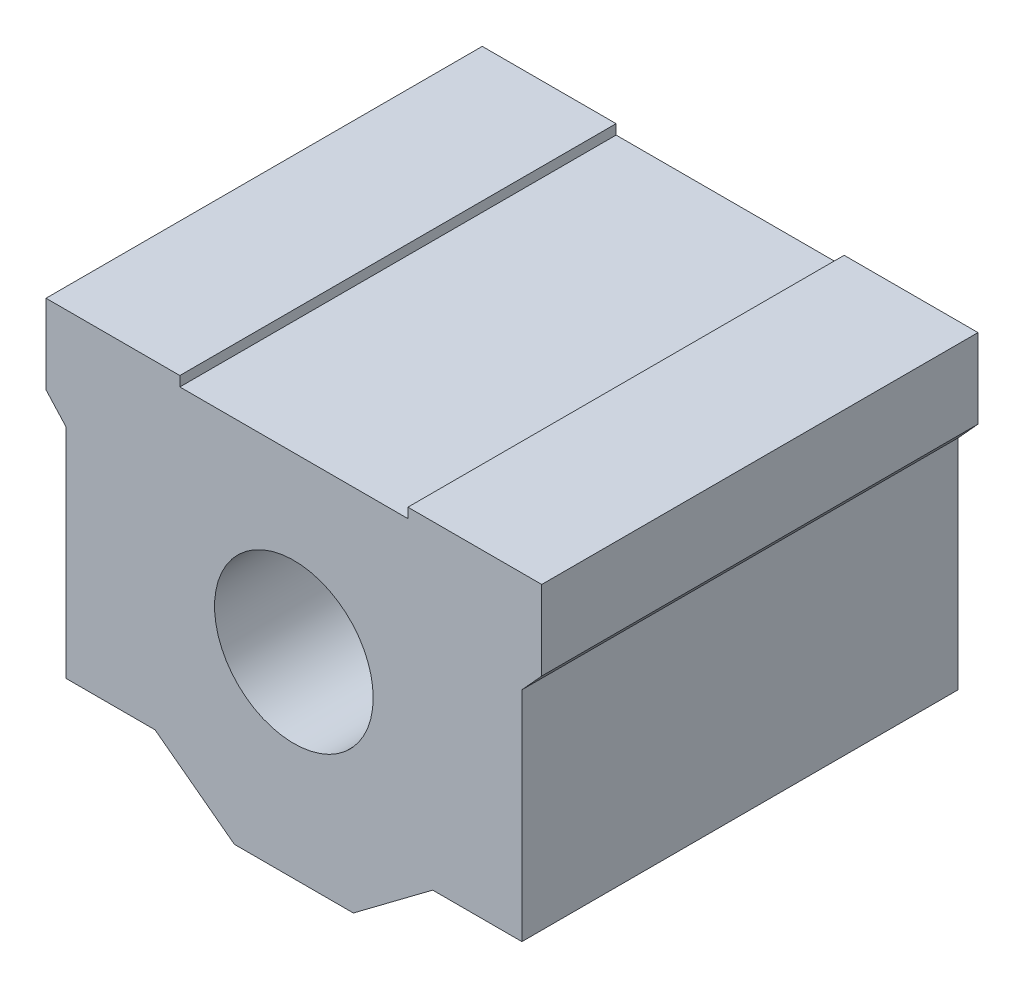
ISO-10303-21;
HEADER;
FILE_DESCRIPTION(('STEP AP214'),'2;1');
FILE_NAME('part.step','',(''),(''),'','','');
FILE_SCHEMA(('AUTOMOTIVE_DESIGN { 1 0 10303 214 1 1 1 1 }'));
ENDSEC;
DATA;
#1=APPLICATION_CONTEXT('core data for automotive mechanical design processes');
#2=APPLICATION_PROTOCOL_DEFINITION('international standard','automotive_design',2000,#1);
#3=PRODUCT_CONTEXT('',#1,'mechanical');
#4=PRODUCT('Part','Part','',(#3));
#5=PRODUCT_RELATED_PRODUCT_CATEGORY('part','',(#4));
#6=PRODUCT_DEFINITION_FORMATION('','',#4);
#7=PRODUCT_DEFINITION_CONTEXT('part definition',#1,'design');
#8=PRODUCT_DEFINITION('design','',#6,#7);
#9=PRODUCT_DEFINITION_SHAPE('','',#8);
#10=(LENGTH_UNIT() NAMED_UNIT(*) SI_UNIT(.MILLI.,.METRE.));
#11=(NAMED_UNIT(*) PLANE_ANGLE_UNIT() SI_UNIT($,.RADIAN.));
#12=(NAMED_UNIT(*) SI_UNIT($,.STERADIAN.) SOLID_ANGLE_UNIT());
#13=UNCERTAINTY_MEASURE_WITH_UNIT(LENGTH_MEASURE(1.E-05),#10,'distance_accuracy_value','');
#14=(GEOMETRIC_REPRESENTATION_CONTEXT(3) GLOBAL_UNCERTAINTY_ASSIGNED_CONTEXT((#13)) GLOBAL_UNIT_ASSIGNED_CONTEXT((#10,
#11,#12)) REPRESENTATION_CONTEXT('',''));
#15=CARTESIAN_POINT('',(0.,0.,0.));
#16=DIRECTION('',(0.,0.,1.));
#17=DIRECTION('',(1.,0.,0.));
#18=AXIS2_PLACEMENT_3D('',#15,#16,#17);
#19=CARTESIAN_POINT('',(0.,0.,44.));
#20=DIRECTION('',(0.,0.,-1.));
#21=DIRECTION('',(-1.,0.,0.));
#22=AXIS2_PLACEMENT_3D('',#19,#20,#21);
#23=PLANE('',#22);
#24=DIRECTION('',(0.8,-0.6,0.));
#25=VECTOR('',#24,1.);
#26=CARTESIAN_POINT('',(-5.99999999999999,0.,44.));
#27=LINE('',#26,#25);
#28=CARTESIAN_POINT('',(-14.,6.,44.));
#29=VERTEX_POINT('',#28);
#30=CARTESIAN_POINT('',(-5.99999999999999,0.,44.));
#31=VERTEX_POINT('',#30);
#32=EDGE_CURVE('E212',#29,#31,#27,.T.);
#33=ORIENTED_EDGE('',*,*,#32,.T.);
#34=DIRECTION('',(1.,0.,0.));
#35=VECTOR('',#34,1.);
#36=CARTESIAN_POINT('',(6.00000000000001,0.,44.));
#37=LINE('',#36,#35);
#38=CARTESIAN_POINT('',(6.00000000000001,0.,44.));
#39=VERTEX_POINT('',#38);
#40=EDGE_CURVE('E120',#31,#39,#37,.T.);
#41=ORIENTED_EDGE('',*,*,#40,.T.);
#42=DIRECTION('',(0.8,0.6,0.));
#43=VECTOR('',#42,1.);
#44=CARTESIAN_POINT('',(6.00000000000001,0.,44.));
#45=LINE('',#44,#43);
#46=CARTESIAN_POINT('',(14.,6.00000000000001,44.));
#47=VERTEX_POINT('',#46);
#48=EDGE_CURVE('E251',#39,#47,#45,.T.);
#49=ORIENTED_EDGE('',*,*,#48,.T.);
#50=DIRECTION('',(1.,0.,0.));
#51=VECTOR('',#50,1.);
#52=CARTESIAN_POINT('',(14.,6.00000000000001,44.));
#53=LINE('',#52,#51);
#54=CARTESIAN_POINT('',(23.,6.00000000000001,44.));
#55=VERTEX_POINT('',#54);
#56=EDGE_CURVE('E270',#47,#55,#53,.T.);
#57=ORIENTED_EDGE('',*,*,#56,.T.);
#58=DIRECTION('',(0.,1.,0.));
#59=VECTOR('',#58,1.);
#60=CARTESIAN_POINT('',(23.,6.00000000000001,44.));
#61=LINE('',#60,#59);
#62=CARTESIAN_POINT('',(23.,28.,44.));
#63=VERTEX_POINT('',#62);
#64=EDGE_CURVE('E267',#55,#63,#61,.T.);
#65=ORIENTED_EDGE('',*,*,#64,.T.);
#66=DIRECTION('',(0.672672793996312,0.739940073395944,0.));
#67=VECTOR('',#66,1.);
#68=CARTESIAN_POINT('',(23.,28.,44.));
#69=LINE('',#68,#67);
#70=CARTESIAN_POINT('',(25.,30.2,44.));
#71=VERTEX_POINT('',#70);
#72=EDGE_CURVE('E269',#63,#71,#69,.T.);
#73=ORIENTED_EDGE('',*,*,#72,.T.);
#74=DIRECTION('',(0.,1.,0.));
#75=VECTOR('',#74,1.);
#76=CARTESIAN_POINT('',(25.,30.2,44.));
#77=LINE('',#76,#75);
#78=CARTESIAN_POINT('',(25.,38.2,44.));
#79=VERTEX_POINT('',#78);
#80=EDGE_CURVE('E272',#71,#79,#77,.T.);
#81=ORIENTED_EDGE('',*,*,#80,.T.);
#82=DIRECTION('',(-1.,0.,0.));
#83=VECTOR('',#82,1.);
#84=CARTESIAN_POINT('',(25.,38.2,44.));
#85=LINE('',#84,#83);
#86=CARTESIAN_POINT('',(11.5,38.2,44.));
#87=VERTEX_POINT('',#86);
#88=EDGE_CURVE('E278',#79,#87,#85,.T.);
#89=ORIENTED_EDGE('',*,*,#88,.T.);
#90=DIRECTION('',(0.,-1.,0.));
#91=VECTOR('',#90,1.);
#92=CARTESIAN_POINT('',(11.5,38.2,44.));
#93=LINE('',#92,#91);
#94=CARTESIAN_POINT('',(11.5,37.2,44.));
#95=VERTEX_POINT('',#94);
#96=EDGE_CURVE('E280',#87,#95,#93,.T.);
#97=ORIENTED_EDGE('',*,*,#96,.T.);
#98=DIRECTION('',(-1.,0.,0.));
#99=VECTOR('',#98,1.);
#100=CARTESIAN_POINT('',(-11.5,37.2,44.));
#101=LINE('',#100,#99);
#102=CARTESIAN_POINT('',(-11.5,37.2,44.));
#103=VERTEX_POINT('',#102);
#104=EDGE_CURVE('E282',#95,#103,#101,.T.);
#105=ORIENTED_EDGE('',*,*,#104,.T.);
#106=DIRECTION('',(0.,1.,0.));
#107=VECTOR('',#106,1.);
#108=CARTESIAN_POINT('',(-11.5,38.2,44.));
#109=LINE('',#108,#107);
#110=CARTESIAN_POINT('',(-11.5,38.2,44.));
#111=VERTEX_POINT('',#110);
#112=EDGE_CURVE('E284',#103,#111,#109,.T.);
#113=ORIENTED_EDGE('',*,*,#112,.T.);
#114=DIRECTION('',(-1.,0.,0.));
#115=VECTOR('',#114,1.);
#116=CARTESIAN_POINT('',(-25.,38.2,44.));
#117=LINE('',#116,#115);
#118=CARTESIAN_POINT('',(-25.,38.2,44.));
#119=VERTEX_POINT('',#118);
#120=EDGE_CURVE('E286',#111,#119,#117,.T.);
#121=ORIENTED_EDGE('',*,*,#120,.T.);
#122=DIRECTION('',(0.,-1.,0.));
#123=VECTOR('',#122,1.);
#124=CARTESIAN_POINT('',(-25.,30.2,44.));
#125=LINE('',#124,#123);
#126=CARTESIAN_POINT('',(-25.,30.2,44.));
#127=VERTEX_POINT('',#126);
#128=EDGE_CURVE('E163',#119,#127,#125,.T.);
#129=ORIENTED_EDGE('',*,*,#128,.T.);
#130=DIRECTION('',(0.672672793996312,-0.739940073395944,0.));
#131=VECTOR('',#130,1.);
#132=CARTESIAN_POINT('',(-23.,28.,44.));
#133=LINE('',#132,#131);
#134=CARTESIAN_POINT('',(-23.,28.,44.));
#135=VERTEX_POINT('',#134);
#136=EDGE_CURVE('E157',#127,#135,#133,.T.);
#137=ORIENTED_EDGE('',*,*,#136,.T.);
#138=DIRECTION('',(0.,-1.,0.));
#139=VECTOR('',#138,1.);
#140=CARTESIAN_POINT('',(-23.,6.,44.));
#141=LINE('',#140,#139);
#142=CARTESIAN_POINT('',(-23.,6.,44.));
#143=VERTEX_POINT('',#142);
#144=EDGE_CURVE('E161',#135,#143,#141,.T.);
#145=ORIENTED_EDGE('',*,*,#144,.T.);
#146=DIRECTION('',(1.,0.,0.));
#147=VECTOR('',#146,1.);
#148=CARTESIAN_POINT('',(-14.,6.,44.));
#149=LINE('',#148,#147);
#150=EDGE_CURVE('E53',#143,#29,#149,.T.);
#151=ORIENTED_EDGE('',*,*,#150,.T.);
#152=EDGE_LOOP('',(#33,#41,#49,#57,#65,#73,#81,#89,#97,#105,#113,#121,#129,#137,#145,#151));
#153=FACE_BOUND('',#152,.T.);
#154=CARTESIAN_POINT('',(0.,19.8,44.));
#155=DIRECTION('',(0.,0.,1.));
#156=DIRECTION('',(1.,0.,0.));
#157=AXIS2_PLACEMENT_3D('',#154,#155,#156);
#158=CIRCLE('',#157,8.);
#159=CARTESIAN_POINT('',(8.,19.8,44.));
#160=VERTEX_POINT('',#159);
#161=EDGE_CURVE('E185',#160,#160,#158,.T.);
#162=ORIENTED_EDGE('',*,*,#161,.F.);
#163=EDGE_LOOP('',(#162));
#164=FACE_BOUND('',#163,.T.);
#165=ADVANCED_FACE('F36',(#153,#164),#23,.F.);
#166=CARTESIAN_POINT('',(0.,0.,0.));
#167=DIRECTION('',(0.,0.,-1.));
#168=DIRECTION('',(-1.,0.,0.));
#169=AXIS2_PLACEMENT_3D('',#166,#167,#168);
#170=PLANE('',#169);
#171=DIRECTION('',(0.8,-0.6,0.));
#172=VECTOR('',#171,1.);
#173=CARTESIAN_POINT('',(-5.99999999999999,0.,0.));
#174=LINE('',#173,#172);
#175=CARTESIAN_POINT('',(-14.,6.,0.));
#176=VERTEX_POINT('',#175);
#177=CARTESIAN_POINT('',(-5.99999999999999,0.,0.));
#178=VERTEX_POINT('',#177);
#179=EDGE_CURVE('E181',#176,#178,#174,.T.);
#180=ORIENTED_EDGE('',*,*,#179,.F.);
#181=DIRECTION('',(1.,0.,0.));
#182=VECTOR('',#181,1.);
#183=CARTESIAN_POINT('',(-14.,6.,0.));
#184=LINE('',#183,#182);
#185=CARTESIAN_POINT('',(-23.,6.,0.));
#186=VERTEX_POINT('',#185);
#187=EDGE_CURVE('E112',#186,#176,#184,.T.);
#188=ORIENTED_EDGE('',*,*,#187,.F.);
#189=DIRECTION('',(0.,-1.,0.));
#190=VECTOR('',#189,1.);
#191=CARTESIAN_POINT('',(-23.,6.,0.));
#192=LINE('',#191,#190);
#193=CARTESIAN_POINT('',(-23.,28.,0.));
#194=VERTEX_POINT('',#193);
#195=EDGE_CURVE('E106',#194,#186,#192,.T.);
#196=ORIENTED_EDGE('',*,*,#195,.F.);
#197=DIRECTION('',(0.672672793996312,-0.739940073395944,0.));
#198=VECTOR('',#197,1.);
#199=CARTESIAN_POINT('',(-23.,28.,0.));
#200=LINE('',#199,#198);
#201=CARTESIAN_POINT('',(-25.,30.2,0.));
#202=VERTEX_POINT('',#201);
#203=EDGE_CURVE('E171',#202,#194,#200,.T.);
#204=ORIENTED_EDGE('',*,*,#203,.F.);
#205=DIRECTION('',(0.,-1.,0.));
#206=VECTOR('',#205,1.);
#207=CARTESIAN_POINT('',(-25.,30.2,0.));
#208=LINE('',#207,#206);
#209=CARTESIAN_POINT('',(-25.,38.2,0.));
#210=VERTEX_POINT('',#209);
#211=EDGE_CURVE('E207',#210,#202,#208,.T.);
#212=ORIENTED_EDGE('',*,*,#211,.F.);
#213=DIRECTION('',(-1.,0.,0.));
#214=VECTOR('',#213,1.);
#215=CARTESIAN_POINT('',(-25.,38.2,0.));
#216=LINE('',#215,#214);
#217=CARTESIAN_POINT('',(-11.5,38.2,0.));
#218=VERTEX_POINT('',#217);
#219=EDGE_CURVE('E205',#218,#210,#216,.T.);
#220=ORIENTED_EDGE('',*,*,#219,.F.);
#221=DIRECTION('',(0.,1.,0.));
#222=VECTOR('',#221,1.);
#223=CARTESIAN_POINT('',(-11.5,38.2,0.));
#224=LINE('',#223,#222);
#225=CARTESIAN_POINT('',(-11.5,37.2,0.));
#226=VERTEX_POINT('',#225);
#227=EDGE_CURVE('E203',#226,#218,#224,.T.);
#228=ORIENTED_EDGE('',*,*,#227,.F.);
#229=DIRECTION('',(-1.,0.,0.));
#230=VECTOR('',#229,1.);
#231=CARTESIAN_POINT('',(-11.5,37.2,0.));
#232=LINE('',#231,#230);
#233=CARTESIAN_POINT('',(11.5,37.2,0.));
#234=VERTEX_POINT('',#233);
#235=EDGE_CURVE('E201',#234,#226,#232,.T.);
#236=ORIENTED_EDGE('',*,*,#235,.F.);
#237=DIRECTION('',(0.,-1.,0.));
#238=VECTOR('',#237,1.);
#239=CARTESIAN_POINT('',(11.5,38.2,0.));
#240=LINE('',#239,#238);
#241=CARTESIAN_POINT('',(11.5,38.2,0.));
#242=VERTEX_POINT('',#241);
#243=EDGE_CURVE('E199',#242,#234,#240,.T.);
#244=ORIENTED_EDGE('',*,*,#243,.F.);
#245=DIRECTION('',(-1.,0.,0.));
#246=VECTOR('',#245,1.);
#247=CARTESIAN_POINT('',(25.,38.2,0.));
#248=LINE('',#247,#246);
#249=CARTESIAN_POINT('',(25.,38.2,0.));
#250=VERTEX_POINT('',#249);
#251=EDGE_CURVE('E197',#250,#242,#248,.T.);
#252=ORIENTED_EDGE('',*,*,#251,.F.);
#253=DIRECTION('',(0.,1.,0.));
#254=VECTOR('',#253,1.);
#255=CARTESIAN_POINT('',(25.,30.2,0.));
#256=LINE('',#255,#254);
#257=CARTESIAN_POINT('',(25.,30.2,0.));
#258=VERTEX_POINT('',#257);
#259=EDGE_CURVE('E195',#258,#250,#256,.T.);
#260=ORIENTED_EDGE('',*,*,#259,.F.);
#261=DIRECTION('',(0.672672793996312,0.739940073395944,0.));
#262=VECTOR('',#261,1.);
#263=CARTESIAN_POINT('',(23.,28.,0.));
#264=LINE('',#263,#262);
#265=CARTESIAN_POINT('',(23.,28.,0.));
#266=VERTEX_POINT('',#265);
#267=EDGE_CURVE('E193',#266,#258,#264,.T.);
#268=ORIENTED_EDGE('',*,*,#267,.F.);
#269=DIRECTION('',(0.,1.,0.));
#270=VECTOR('',#269,1.);
#271=CARTESIAN_POINT('',(23.,6.00000000000001,0.));
#272=LINE('',#271,#270);
#273=CARTESIAN_POINT('',(23.,6.00000000000001,0.));
#274=VERTEX_POINT('',#273);
#275=EDGE_CURVE('E191',#274,#266,#272,.T.);
#276=ORIENTED_EDGE('',*,*,#275,.F.);
#277=DIRECTION('',(1.,0.,0.));
#278=VECTOR('',#277,1.);
#279=CARTESIAN_POINT('',(14.,6.00000000000001,0.));
#280=LINE('',#279,#278);
#281=CARTESIAN_POINT('',(14.,6.00000000000001,0.));
#282=VERTEX_POINT('',#281);
#283=EDGE_CURVE('E189',#282,#274,#280,.T.);
#284=ORIENTED_EDGE('',*,*,#283,.F.);
#285=DIRECTION('',(0.8,0.6,0.));
#286=VECTOR('',#285,1.);
#287=CARTESIAN_POINT('',(6.00000000000001,0.,0.));
#288=LINE('',#287,#286);
#289=CARTESIAN_POINT('',(6.00000000000001,0.,0.));
#290=VERTEX_POINT('',#289);
#291=EDGE_CURVE('E187',#290,#282,#288,.T.);
#292=ORIENTED_EDGE('',*,*,#291,.F.);
#293=DIRECTION('',(1.,0.,0.));
#294=VECTOR('',#293,1.);
#295=CARTESIAN_POINT('',(6.00000000000001,0.,0.));
#296=LINE('',#295,#294);
#297=EDGE_CURVE('E184',#178,#290,#296,.T.);
#298=ORIENTED_EDGE('',*,*,#297,.F.);
#299=EDGE_LOOP('',(#180,#188,#196,#204,#212,#220,#228,#236,#244,#252,#260,#268,#276,#284,#292,#298));
#300=FACE_BOUND('',#299,.T.);
#301=CARTESIAN_POINT('',(0.,19.8,0.));
#302=DIRECTION('',(0.,0.,1.));
#303=DIRECTION('',(1.,0.,0.));
#304=AXIS2_PLACEMENT_3D('',#301,#302,#303);
#305=CIRCLE('',#304,8.);
#306=CARTESIAN_POINT('',(8.,19.8,0.));
#307=VERTEX_POINT('',#306);
#308=EDGE_CURVE('E485',#307,#307,#305,.T.);
#309=ORIENTED_EDGE('',*,*,#308,.T.);
#310=EDGE_LOOP('',(#309));
#311=FACE_BOUND('',#310,.T.);
#312=ADVANCED_FACE('F255',(#300,#311),#170,.T.);
#313=CARTESIAN_POINT('',(-5.99999999999999,0.,44.));
#314=DIRECTION('',(0.6,0.8,0.));
#315=DIRECTION('',(-0.8,0.6,0.));
#316=AXIS2_PLACEMENT_3D('',#313,#314,#315);
#317=PLANE('',#316);
#318=ORIENTED_EDGE('',*,*,#179,.T.);
#319=DIRECTION('',(0.,0.,-1.));
#320=VECTOR('',#319,1.);
#321=CARTESIAN_POINT('',(-5.99999999999999,0.,44.));
#322=LINE('',#321,#320);
#323=EDGE_CURVE('E11',#31,#178,#322,.T.);
#324=ORIENTED_EDGE('',*,*,#323,.F.);
#325=ORIENTED_EDGE('',*,*,#32,.F.);
#326=DIRECTION('',(0.,0.,-1.));
#327=VECTOR('',#326,1.);
#328=CARTESIAN_POINT('',(-14.,6.,44.));
#329=LINE('',#328,#327);
#330=EDGE_CURVE('E177',#29,#176,#329,.T.);
#331=ORIENTED_EDGE('',*,*,#330,.T.);
#332=EDGE_LOOP('',(#318,#324,#325,#331));
#333=FACE_BOUND('',#332,.T.);
#334=ADVANCED_FACE('F38',(#333),#317,.F.);
#335=CARTESIAN_POINT('',(6.00000000000001,0.,44.));
#336=DIRECTION('',(0.,1.,0.));
#337=DIRECTION('',(-1.,0.,0.));
#338=AXIS2_PLACEMENT_3D('',#335,#336,#337);
#339=PLANE('',#338);
#340=ORIENTED_EDGE('',*,*,#297,.T.);
#341=DIRECTION('',(0.,0.,-1.));
#342=VECTOR('',#341,1.);
#343=CARTESIAN_POINT('',(6.00000000000001,0.,44.));
#344=LINE('',#343,#342);
#345=EDGE_CURVE('E45',#39,#290,#344,.T.);
#346=ORIENTED_EDGE('',*,*,#345,.F.);
#347=ORIENTED_EDGE('',*,*,#40,.F.);
#348=ORIENTED_EDGE('',*,*,#323,.T.);
#349=EDGE_LOOP('',(#340,#346,#347,#348));
#350=FACE_BOUND('',#349,.T.);
#351=ADVANCED_FACE('F320',(#350),#339,.F.);
#352=CARTESIAN_POINT('',(6.00000000000001,0.,44.));
#353=DIRECTION('',(-0.6,0.8,0.));
#354=DIRECTION('',(-0.8,-0.6,0.));
#355=AXIS2_PLACEMENT_3D('',#352,#353,#354);
#356=PLANE('',#355);
#357=ORIENTED_EDGE('',*,*,#291,.T.);
#358=DIRECTION('',(0.,0.,-1.));
#359=VECTOR('',#358,1.);
#360=CARTESIAN_POINT('',(14.,6.00000000000001,44.));
#361=LINE('',#360,#359);
#362=EDGE_CURVE('E243',#47,#282,#361,.T.);
#363=ORIENTED_EDGE('',*,*,#362,.F.);
#364=ORIENTED_EDGE('',*,*,#48,.F.);
#365=ORIENTED_EDGE('',*,*,#345,.T.);
#366=EDGE_LOOP('',(#357,#363,#364,#365));
#367=FACE_BOUND('',#366,.T.);
#368=ADVANCED_FACE('F249',(#367),#356,.F.);
#369=CARTESIAN_POINT('',(14.,6.00000000000001,44.));
#370=DIRECTION('',(0.,1.,0.));
#371=DIRECTION('',(-1.,0.,0.));
#372=AXIS2_PLACEMENT_3D('',#369,#370,#371);
#373=PLANE('',#372);
#374=ORIENTED_EDGE('',*,*,#283,.T.);
#375=DIRECTION('',(0.,0.,-1.));
#376=VECTOR('',#375,1.);
#377=CARTESIAN_POINT('',(23.,6.00000000000001,44.));
#378=LINE('',#377,#376);
#379=EDGE_CURVE('E240',#55,#274,#378,.T.);
#380=ORIENTED_EDGE('',*,*,#379,.F.);
#381=ORIENTED_EDGE('',*,*,#56,.F.);
#382=ORIENTED_EDGE('',*,*,#362,.T.);
#383=EDGE_LOOP('',(#374,#380,#381,#382));
#384=FACE_BOUND('',#383,.T.);
#385=ADVANCED_FACE('F261',(#384),#373,.F.);
#386=CARTESIAN_POINT('',(23.,6.00000000000001,44.));
#387=DIRECTION('',(-1.,0.,0.));
#388=DIRECTION('',(0.,-1.,0.));
#389=AXIS2_PLACEMENT_3D('',#386,#387,#388);
#390=PLANE('',#389);
#391=ORIENTED_EDGE('',*,*,#275,.T.);
#392=DIRECTION('',(0.,0.,-1.));
#393=VECTOR('',#392,1.);
#394=CARTESIAN_POINT('',(23.,28.,44.));
#395=LINE('',#394,#393);
#396=EDGE_CURVE('E237',#63,#266,#395,.T.);
#397=ORIENTED_EDGE('',*,*,#396,.F.);
#398=ORIENTED_EDGE('',*,*,#64,.F.);
#399=ORIENTED_EDGE('',*,*,#379,.T.);
#400=EDGE_LOOP('',(#391,#397,#398,#399));
#401=FACE_BOUND('',#400,.T.);
#402=ADVANCED_FACE('F265',(#401),#390,.F.);
#403=CARTESIAN_POINT('',(23.,28.,44.));
#404=DIRECTION('',(-0.739940073395944,0.672672793996312,0.));
#405=DIRECTION('',(-0.672672793996312,-0.739940073395944,0.));
#406=AXIS2_PLACEMENT_3D('',#403,#404,#405);
#407=PLANE('',#406);
#408=ORIENTED_EDGE('',*,*,#267,.T.);
#409=DIRECTION('',(0.,0.,-1.));
#410=VECTOR('',#409,1.);
#411=CARTESIAN_POINT('',(25.,30.2,44.));
#412=LINE('',#411,#410);
#413=EDGE_CURVE('E234',#71,#258,#412,.T.);
#414=ORIENTED_EDGE('',*,*,#413,.F.);
#415=ORIENTED_EDGE('',*,*,#72,.F.);
#416=ORIENTED_EDGE('',*,*,#396,.T.);
#417=EDGE_LOOP('',(#408,#414,#415,#416));
#418=FACE_BOUND('',#417,.T.);
#419=ADVANCED_FACE('F333',(#418),#407,.F.);
#420=CARTESIAN_POINT('',(25.,30.2,44.));
#421=DIRECTION('',(-1.,0.,0.));
#422=DIRECTION('',(0.,0.,1.));
#423=AXIS2_PLACEMENT_3D('',#420,#421,#422);
#424=PLANE('',#423);
#425=ORIENTED_EDGE('',*,*,#259,.T.);
#426=DIRECTION('',(0.,0.,-1.));
#427=VECTOR('',#426,1.);
#428=CARTESIAN_POINT('',(25.,38.2,44.));
#429=LINE('',#428,#427);
#430=EDGE_CURVE('E231',#79,#250,#429,.T.);
#431=ORIENTED_EDGE('',*,*,#430,.F.);
#432=ORIENTED_EDGE('',*,*,#80,.F.);
#433=ORIENTED_EDGE('',*,*,#413,.T.);
#434=EDGE_LOOP('',(#425,#431,#432,#433));
#435=FACE_BOUND('',#434,.T.);
#436=ADVANCED_FACE('F336',(#435),#424,.F.);
#437=CARTESIAN_POINT('',(25.,38.2,44.));
#438=DIRECTION('',(0.,-1.,0.));
#439=DIRECTION('',(1.,0.,0.));
#440=AXIS2_PLACEMENT_3D('',#437,#438,#439);
#441=PLANE('',#440);
#442=ORIENTED_EDGE('',*,*,#251,.T.);
#443=DIRECTION('',(0.,0.,-1.));
#444=VECTOR('',#443,1.);
#445=CARTESIAN_POINT('',(11.5,38.2,44.));
#446=LINE('',#445,#444);
#447=EDGE_CURVE('E228',#87,#242,#446,.T.);
#448=ORIENTED_EDGE('',*,*,#447,.F.);
#449=ORIENTED_EDGE('',*,*,#88,.F.);
#450=ORIENTED_EDGE('',*,*,#430,.T.);
#451=EDGE_LOOP('',(#442,#448,#449,#450));
#452=FACE_BOUND('',#451,.T.);
#453=ADVANCED_FACE('F340',(#452),#441,.F.);
#454=CARTESIAN_POINT('',(11.5,38.2,44.));
#455=DIRECTION('',(1.,0.,0.));
#456=DIRECTION('',(0.,0.,-1.));
#457=AXIS2_PLACEMENT_3D('',#454,#455,#456);
#458=PLANE('',#457);
#459=ORIENTED_EDGE('',*,*,#243,.T.);
#460=DIRECTION('',(0.,0.,-1.));
#461=VECTOR('',#460,1.);
#462=CARTESIAN_POINT('',(11.5,37.2,44.));
#463=LINE('',#462,#461);
#464=EDGE_CURVE('E225',#95,#234,#463,.T.);
#465=ORIENTED_EDGE('',*,*,#464,.F.);
#466=ORIENTED_EDGE('',*,*,#96,.F.);
#467=ORIENTED_EDGE('',*,*,#447,.T.);
#468=EDGE_LOOP('',(#459,#465,#466,#467));
#469=FACE_BOUND('',#468,.T.);
#470=ADVANCED_FACE('F344',(#469),#458,.F.);
#471=CARTESIAN_POINT('',(-11.5,37.2,44.));
#472=DIRECTION('',(0.,-1.,0.));
#473=DIRECTION('',(0.,0.,-1.));
#474=AXIS2_PLACEMENT_3D('',#471,#472,#473);
#475=PLANE('',#474);
#476=ORIENTED_EDGE('',*,*,#235,.T.);
#477=DIRECTION('',(0.,0.,-1.));
#478=VECTOR('',#477,1.);
#479=CARTESIAN_POINT('',(-11.5,37.2,44.));
#480=LINE('',#479,#478);
#481=EDGE_CURVE('E222',#103,#226,#480,.T.);
#482=ORIENTED_EDGE('',*,*,#481,.F.);
#483=ORIENTED_EDGE('',*,*,#104,.F.);
#484=ORIENTED_EDGE('',*,*,#464,.T.);
#485=EDGE_LOOP('',(#476,#482,#483,#484));
#486=FACE_BOUND('',#485,.T.);
#487=ADVANCED_FACE('F348',(#486),#475,.F.);
#488=CARTESIAN_POINT('',(-11.5,38.2,44.));
#489=DIRECTION('',(-1.,0.,0.));
#490=DIRECTION('',(0.,0.,1.));
#491=AXIS2_PLACEMENT_3D('',#488,#489,#490);
#492=PLANE('',#491);
#493=ORIENTED_EDGE('',*,*,#227,.T.);
#494=DIRECTION('',(0.,0.,-1.));
#495=VECTOR('',#494,1.);
#496=CARTESIAN_POINT('',(-11.5,38.2,44.));
#497=LINE('',#496,#495);
#498=EDGE_CURVE('E219',#111,#218,#497,.T.);
#499=ORIENTED_EDGE('',*,*,#498,.F.);
#500=ORIENTED_EDGE('',*,*,#112,.F.);
#501=ORIENTED_EDGE('',*,*,#481,.T.);
#502=EDGE_LOOP('',(#493,#499,#500,#501));
#503=FACE_BOUND('',#502,.T.);
#504=ADVANCED_FACE('F352',(#503),#492,.F.);
#505=CARTESIAN_POINT('',(-25.,38.2,44.));
#506=DIRECTION('',(0.,-1.,0.));
#507=DIRECTION('',(1.,0.,0.));
#508=AXIS2_PLACEMENT_3D('',#505,#506,#507);
#509=PLANE('',#508);
#510=ORIENTED_EDGE('',*,*,#219,.T.);
#511=DIRECTION('',(0.,0.,-1.));
#512=VECTOR('',#511,1.);
#513=CARTESIAN_POINT('',(-25.,38.2,44.));
#514=LINE('',#513,#512);
#515=EDGE_CURVE('E216',#119,#210,#514,.T.);
#516=ORIENTED_EDGE('',*,*,#515,.F.);
#517=ORIENTED_EDGE('',*,*,#120,.F.);
#518=ORIENTED_EDGE('',*,*,#498,.T.);
#519=EDGE_LOOP('',(#510,#516,#517,#518));
#520=FACE_BOUND('',#519,.T.);
#521=ADVANCED_FACE('F292',(#520),#509,.F.);
#522=CARTESIAN_POINT('',(-25.,30.2,44.));
#523=DIRECTION('',(1.,0.,0.));
#524=DIRECTION('',(0.,0.,-1.));
#525=AXIS2_PLACEMENT_3D('',#522,#523,#524);
#526=PLANE('',#525);
#527=ORIENTED_EDGE('',*,*,#211,.T.);
#528=DIRECTION('',(0.,0.,-1.));
#529=VECTOR('',#528,1.);
#530=CARTESIAN_POINT('',(-25.,30.2,44.));
#531=LINE('',#530,#529);
#532=EDGE_CURVE('E172',#127,#202,#531,.T.);
#533=ORIENTED_EDGE('',*,*,#532,.F.);
#534=ORIENTED_EDGE('',*,*,#128,.F.);
#535=ORIENTED_EDGE('',*,*,#515,.T.);
#536=EDGE_LOOP('',(#527,#533,#534,#535));
#537=FACE_BOUND('',#536,.T.);
#538=ADVANCED_FACE('F296',(#537),#526,.F.);
#539=CARTESIAN_POINT('',(-23.,28.,44.));
#540=DIRECTION('',(0.739940073395944,0.672672793996312,0.));
#541=DIRECTION('',(-0.672672793996312,0.739940073395944,0.));
#542=AXIS2_PLACEMENT_3D('',#539,#540,#541);
#543=PLANE('',#542);
#544=ORIENTED_EDGE('',*,*,#203,.T.);
#545=DIRECTION('',(0.,0.,-1.));
#546=VECTOR('',#545,1.);
#547=CARTESIAN_POINT('',(-23.,28.,44.));
#548=LINE('',#547,#546);
#549=EDGE_CURVE('E168',#135,#194,#548,.T.);
#550=ORIENTED_EDGE('',*,*,#549,.F.);
#551=ORIENTED_EDGE('',*,*,#136,.F.);
#552=ORIENTED_EDGE('',*,*,#532,.T.);
#553=EDGE_LOOP('',(#544,#550,#551,#552));
#554=FACE_BOUND('',#553,.T.);
#555=ADVANCED_FACE('F169',(#554),#543,.F.);
#556=CARTESIAN_POINT('',(-23.,6.,44.));
#557=DIRECTION('',(1.,0.,0.));
#558=DIRECTION('',(0.,0.,-1.));
#559=AXIS2_PLACEMENT_3D('',#556,#557,#558);
#560=PLANE('',#559);
#561=ORIENTED_EDGE('',*,*,#195,.T.);
#562=DIRECTION('',(0.,0.,-1.));
#563=VECTOR('',#562,1.);
#564=CARTESIAN_POINT('',(-23.,6.,44.));
#565=LINE('',#564,#563);
#566=EDGE_CURVE('E173',#143,#186,#565,.T.);
#567=ORIENTED_EDGE('',*,*,#566,.F.);
#568=ORIENTED_EDGE('',*,*,#144,.F.);
#569=ORIENTED_EDGE('',*,*,#549,.T.);
#570=EDGE_LOOP('',(#561,#567,#568,#569));
#571=FACE_BOUND('',#570,.T.);
#572=ADVANCED_FACE('F175',(#571),#560,.F.);
#573=CARTESIAN_POINT('',(-14.,6.,44.));
#574=DIRECTION('',(0.,1.,0.));
#575=DIRECTION('',(0.,0.,1.));
#576=AXIS2_PLACEMENT_3D('',#573,#574,#575);
#577=PLANE('',#576);
#578=ORIENTED_EDGE('',*,*,#187,.T.);
#579=ORIENTED_EDGE('',*,*,#330,.F.);
#580=ORIENTED_EDGE('',*,*,#150,.F.);
#581=ORIENTED_EDGE('',*,*,#566,.T.);
#582=EDGE_LOOP('',(#578,#579,#580,#581));
#583=FACE_BOUND('',#582,.T.);
#584=ADVANCED_FACE('F300',(#583),#577,.F.);
#585=CARTESIAN_POINT('',(0.,19.8,44.));
#586=DIRECTION('',(0.,0.,-1.));
#587=DIRECTION('',(-1.,0.,0.));
#588=AXIS2_PLACEMENT_3D('',#585,#586,#587);
#589=CYLINDRICAL_SURFACE('',#588,8.);
#590=ORIENTED_EDGE('',*,*,#161,.T.);
#591=EDGE_LOOP('',(#590));
#592=FACE_BOUND('',#591,.T.);
#593=ORIENTED_EDGE('',*,*,#308,.F.);
#594=EDGE_LOOP('',(#593));
#595=FACE_BOUND('',#594,.T.);
#596=ADVANCED_FACE('F302',(#592,#595),#589,.F.);
#597=CLOSED_SHELL('',(#165,#312,#334,#351,#368,#385,#402,#419,#436,#453,#470,#487,#504,#521,
#538,#555,#572,#584,#596));
#598=MANIFOLD_SOLID_BREP('B2',#597);
#599=ADVANCED_BREP_SHAPE_REPRESENTATION('',(#18,#598),#14);
#600=SHAPE_DEFINITION_REPRESENTATION(#9,#599);
ENDSEC;
END-ISO-10303-21;
